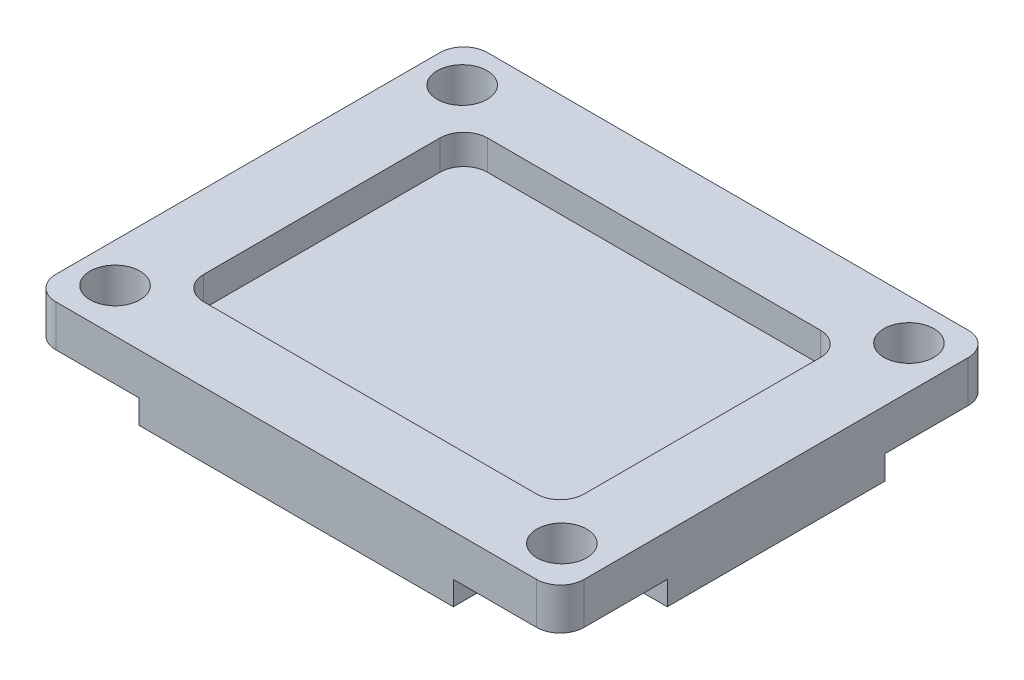
ISO-10303-21;
HEADER;
FILE_DESCRIPTION(('STEP AP214'),'2;1');
FILE_NAME('part.step','',(''),(''),'','','');
FILE_SCHEMA(('AUTOMOTIVE_DESIGN { 1 0 10303 214 1 1 1 1 }'));
ENDSEC;
DATA;
#1=APPLICATION_CONTEXT('core data for automotive mechanical design processes');
#2=APPLICATION_PROTOCOL_DEFINITION('international standard','automotive_design',2000,#1);
#3=PRODUCT_CONTEXT('',#1,'mechanical');
#4=PRODUCT('Part','Part','',(#3));
#5=PRODUCT_RELATED_PRODUCT_CATEGORY('part','',(#4));
#6=PRODUCT_DEFINITION_FORMATION('','',#4);
#7=PRODUCT_DEFINITION_CONTEXT('part definition',#1,'design');
#8=PRODUCT_DEFINITION('design','',#6,#7);
#9=PRODUCT_DEFINITION_SHAPE('','',#8);
#10=(LENGTH_UNIT() NAMED_UNIT(*) SI_UNIT(.MILLI.,.METRE.));
#11=(NAMED_UNIT(*) PLANE_ANGLE_UNIT() SI_UNIT($,.RADIAN.));
#12=(NAMED_UNIT(*) SI_UNIT($,.STERADIAN.) SOLID_ANGLE_UNIT());
#13=UNCERTAINTY_MEASURE_WITH_UNIT(LENGTH_MEASURE(1.E-05),#10,'distance_accuracy_value','');
#14=(GEOMETRIC_REPRESENTATION_CONTEXT(3) GLOBAL_UNCERTAINTY_ASSIGNED_CONTEXT((#13)) GLOBAL_UNIT_ASSIGNED_CONTEXT((#10,
#11,#12)) REPRESENTATION_CONTEXT('',''));
#15=CARTESIAN_POINT('',(0.,0.,0.));
#16=DIRECTION('',(0.,0.,1.));
#17=DIRECTION('',(1.,0.,0.));
#18=AXIS2_PLACEMENT_3D('',#15,#16,#17);
#19=CARTESIAN_POINT('',(3.30200000000001,0.,-32.891));
#20=DIRECTION('',(0.,1.,0.));
#21=DIRECTION('',(0.,0.,1.));
#22=AXIS2_PLACEMENT_3D('',#19,#20,#21);
#23=CYLINDRICAL_SURFACE('',#22,2.1);
#24=CARTESIAN_POINT('',(3.30200000000001,5.5,-32.891));
#25=DIRECTION('',(0.,1.,0.));
#26=DIRECTION('',(0.,0.,1.));
#27=AXIS2_PLACEMENT_3D('',#24,#25,#26);
#28=CIRCLE('',#27,2.1);
#29=CARTESIAN_POINT('',(3.30200000000001,5.5,-30.791));
#30=VERTEX_POINT('',#29);
#31=EDGE_CURVE('E357',#30,#30,#28,.T.);
#32=ORIENTED_EDGE('',*,*,#31,.T.);
#33=EDGE_LOOP('',(#32));
#34=FACE_BOUND('',#33,.T.);
#35=CARTESIAN_POINT('',(3.30200000000001,2.,-32.891));
#36=DIRECTION('',(0.,-1.,0.));
#37=DIRECTION('',(0.,0.,-1.));
#38=AXIS2_PLACEMENT_3D('',#35,#36,#37);
#39=CIRCLE('',#38,2.1);
#40=CARTESIAN_POINT('',(3.30200000000001,2.,-34.991));
#41=VERTEX_POINT('',#40);
#42=EDGE_CURVE('E326',#41,#41,#39,.F.);
#43=ORIENTED_EDGE('',*,*,#42,.F.);
#44=EDGE_LOOP('',(#43));
#45=FACE_BOUND('',#44,.T.);
#46=ADVANCED_FACE('F35',(#34,#45),#23,.F.);
#47=CARTESIAN_POINT('',(40.894,0.,-3.683));
#48=DIRECTION('',(0.,1.,0.));
#49=DIRECTION('',(0.,0.,1.));
#50=AXIS2_PLACEMENT_3D('',#47,#48,#49);
#51=CYLINDRICAL_SURFACE('',#50,2.1);
#52=CARTESIAN_POINT('',(40.894,5.5,-3.683));
#53=DIRECTION('',(0.,1.,0.));
#54=DIRECTION('',(0.,0.,1.));
#55=AXIS2_PLACEMENT_3D('',#52,#53,#54);
#56=CIRCLE('',#55,2.1);
#57=CARTESIAN_POINT('',(40.894,5.5,-1.583));
#58=VERTEX_POINT('',#57);
#59=EDGE_CURVE('E358',#58,#58,#56,.T.);
#60=ORIENTED_EDGE('',*,*,#59,.T.);
#61=EDGE_LOOP('',(#60));
#62=FACE_BOUND('',#61,.T.);
#63=CARTESIAN_POINT('',(40.894,2.,-3.683));
#64=DIRECTION('',(0.,-1.,0.));
#65=DIRECTION('',(0.,0.,-1.));
#66=AXIS2_PLACEMENT_3D('',#63,#64,#65);
#67=CIRCLE('',#66,2.1);
#68=CARTESIAN_POINT('',(40.894,2.,-5.783));
#69=VERTEX_POINT('',#68);
#70=EDGE_CURVE('E320',#69,#69,#67,.F.);
#71=ORIENTED_EDGE('',*,*,#70,.F.);
#72=EDGE_LOOP('',(#71));
#73=FACE_BOUND('',#72,.T.);
#74=ADVANCED_FACE('F544',(#62,#73),#51,.F.);
#75=CARTESIAN_POINT('',(2.00000000000001,5.5,-34.32));
#76=DIRECTION('',(0.,-1.,0.));
#77=DIRECTION('',(0.,0.,-1.));
#78=AXIS2_PLACEMENT_3D('',#75,#76,#77);
#79=CYLINDRICAL_SURFACE('',#78,2.);
#80=DIRECTION('',(0.,-1.,0.));
#81=VECTOR('',#80,1.);
#82=CARTESIAN_POINT('',(2.00000000000001,5.5,-36.32));
#83=LINE('',#82,#81);
#84=CARTESIAN_POINT('',(2.00000000000001,2.,-36.32));
#85=VERTEX_POINT('',#84);
#86=CARTESIAN_POINT('',(2.00000000000001,5.5,-36.32));
#87=VERTEX_POINT('',#86);
#88=EDGE_CURVE('E397',#85,#87,#83,.F.);
#89=ORIENTED_EDGE('',*,*,#88,.F.);
#90=CARTESIAN_POINT('',(2.00000000000001,2.,-34.32));
#91=DIRECTION('',(0.,-1.,0.));
#92=DIRECTION('',(0.,0.,-1.));
#93=AXIS2_PLACEMENT_3D('',#90,#91,#92);
#94=CIRCLE('',#93,2.);
#95=CARTESIAN_POINT('',(0.,2.,-34.32));
#96=VERTEX_POINT('',#95);
#97=EDGE_CURVE('E11',#85,#96,#94,.F.);
#98=ORIENTED_EDGE('',*,*,#97,.T.);
#99=DIRECTION('',(0.,-1.,0.));
#100=VECTOR('',#99,1.);
#101=CARTESIAN_POINT('',(0.,5.5,-34.32));
#102=LINE('',#101,#100);
#103=CARTESIAN_POINT('',(0.,5.5,-34.32));
#104=VERTEX_POINT('',#103);
#105=EDGE_CURVE('E391',#104,#96,#102,.T.);
#106=ORIENTED_EDGE('',*,*,#105,.F.);
#107=CARTESIAN_POINT('',(2.00000000000001,5.5,-34.32));
#108=DIRECTION('',(0.,1.,0.));
#109=DIRECTION('',(0.,0.,1.));
#110=AXIS2_PLACEMENT_3D('',#107,#108,#109);
#111=CIRCLE('',#110,2.);
#112=EDGE_CURVE('E405',#87,#104,#111,.T.);
#113=ORIENTED_EDGE('',*,*,#112,.F.);
#114=EDGE_LOOP('',(#89,#98,#106,#113));
#115=FACE_BOUND('',#114,.T.);
#116=ADVANCED_FACE('F480',(#115),#79,.T.);
#117=CARTESIAN_POINT('',(42.45,5.5,-2.));
#118=DIRECTION('',(0.,-1.,0.));
#119=DIRECTION('',(0.,0.,-1.));
#120=AXIS2_PLACEMENT_3D('',#117,#118,#119);
#121=CYLINDRICAL_SURFACE('',#120,2.);
#122=DIRECTION('',(0.,-1.,0.));
#123=VECTOR('',#122,1.);
#124=CARTESIAN_POINT('',(42.45,5.5,0.));
#125=LINE('',#124,#123);
#126=CARTESIAN_POINT('',(42.45,2.,0.));
#127=VERTEX_POINT('',#126);
#128=CARTESIAN_POINT('',(42.45,5.5,0.));
#129=VERTEX_POINT('',#128);
#130=EDGE_CURVE('E415',#127,#129,#125,.F.);
#131=ORIENTED_EDGE('',*,*,#130,.F.);
#132=CARTESIAN_POINT('',(42.45,2.,-2.));
#133=DIRECTION('',(0.,-1.,0.));
#134=DIRECTION('',(0.,0.,-1.));
#135=AXIS2_PLACEMENT_3D('',#132,#133,#134);
#136=CIRCLE('',#135,2.);
#137=CARTESIAN_POINT('',(44.45,2.,-2.));
#138=VERTEX_POINT('',#137);
#139=EDGE_CURVE('E455',#127,#138,#136,.F.);
#140=ORIENTED_EDGE('',*,*,#139,.T.);
#141=DIRECTION('',(0.,-1.,0.));
#142=VECTOR('',#141,1.);
#143=CARTESIAN_POINT('',(44.45,5.5,-2.));
#144=LINE('',#143,#142);
#145=CARTESIAN_POINT('',(44.45,5.5,-2.));
#146=VERTEX_POINT('',#145);
#147=EDGE_CURVE('E407',#146,#138,#144,.T.);
#148=ORIENTED_EDGE('',*,*,#147,.F.);
#149=CARTESIAN_POINT('',(42.45,5.5,-2.));
#150=DIRECTION('',(0.,1.,0.));
#151=DIRECTION('',(0.,0.,1.));
#152=AXIS2_PLACEMENT_3D('',#149,#150,#151);
#153=CIRCLE('',#152,2.);
#154=EDGE_CURVE('E401',#129,#146,#153,.T.);
#155=ORIENTED_EDGE('',*,*,#154,.F.);
#156=EDGE_LOOP('',(#131,#140,#148,#155));
#157=FACE_BOUND('',#156,.T.);
#158=ADVANCED_FACE('F500',(#157),#121,.T.);
#159=CARTESIAN_POINT('',(0.,5.5,-36.32));
#160=DIRECTION('',(1.,0.,0.));
#161=DIRECTION('',(0.,0.,-1.));
#162=AXIS2_PLACEMENT_3D('',#159,#160,#161);
#163=PLANE('',#162);
#164=DIRECTION('',(0.,0.,-1.));
#165=VECTOR('',#164,1.);
#166=CARTESIAN_POINT('',(0.,2.,-27.32));
#167=LINE('',#166,#165);
#168=CARTESIAN_POINT('',(0.,2.,-27.32));
#169=VERTEX_POINT('',#168);
#170=EDGE_CURVE('E50',#169,#96,#167,.T.);
#171=ORIENTED_EDGE('',*,*,#170,.F.);
#172=DIRECTION('',(0.,-1.,0.));
#173=VECTOR('',#172,1.);
#174=CARTESIAN_POINT('',(0.,2.,-27.32));
#175=LINE('',#174,#173);
#176=CARTESIAN_POINT('',(0.,0.,-27.32));
#177=VERTEX_POINT('',#176);
#178=EDGE_CURVE('E270',#169,#177,#175,.T.);
#179=ORIENTED_EDGE('',*,*,#178,.T.);
#180=DIRECTION('',(0.,0.,1.));
#181=VECTOR('',#180,1.);
#182=CARTESIAN_POINT('',(0.,0.,-36.32));
#183=LINE('',#182,#181);
#184=CARTESIAN_POINT('',(0.,0.,-9.));
#185=VERTEX_POINT('',#184);
#186=EDGE_CURVE('E365',#177,#185,#183,.T.);
#187=ORIENTED_EDGE('',*,*,#186,.T.);
#188=DIRECTION('',(0.,-1.,0.));
#189=VECTOR('',#188,1.);
#190=CARTESIAN_POINT('',(0.,2.,-9.));
#191=LINE('',#190,#189);
#192=CARTESIAN_POINT('',(0.,2.,-9.));
#193=VERTEX_POINT('',#192);
#194=EDGE_CURVE('E307',#193,#185,#191,.T.);
#195=ORIENTED_EDGE('',*,*,#194,.F.);
#196=DIRECTION('',(0.,0.,-1.));
#197=VECTOR('',#196,1.);
#198=CARTESIAN_POINT('',(0.,2.,-9.));
#199=LINE('',#198,#197);
#200=CARTESIAN_POINT('',(0.,2.,-2.));
#201=VERTEX_POINT('',#200);
#202=EDGE_CURVE('E296',#201,#193,#199,.T.);
#203=ORIENTED_EDGE('',*,*,#202,.F.);
#204=DIRECTION('',(0.,-1.,0.));
#205=VECTOR('',#204,1.);
#206=CARTESIAN_POINT('',(0.,5.5,-2.));
#207=LINE('',#206,#205);
#208=CARTESIAN_POINT('',(0.,5.5,-2.));
#209=VERTEX_POINT('',#208);
#210=EDGE_CURVE('E379',#201,#209,#207,.F.);
#211=ORIENTED_EDGE('',*,*,#210,.T.);
#212=DIRECTION('',(0.,0.,1.));
#213=VECTOR('',#212,1.);
#214=CARTESIAN_POINT('',(0.,5.5,-36.32));
#215=LINE('',#214,#213);
#216=EDGE_CURVE('E366',#104,#209,#215,.T.);
#217=ORIENTED_EDGE('',*,*,#216,.F.);
#218=ORIENTED_EDGE('',*,*,#105,.T.);
#219=EDGE_LOOP('',(#171,#179,#187,#195,#203,#211,#217,#218));
#220=FACE_BOUND('',#219,.T.);
#221=ADVANCED_FACE('F485',(#220),#163,.F.);
#222=CARTESIAN_POINT('',(0.,5.5,0.));
#223=DIRECTION('',(0.,0.,-1.));
#224=DIRECTION('',(-1.,0.,0.));
#225=AXIS2_PLACEMENT_3D('',#222,#223,#224);
#226=PLANE('',#225);
#227=DIRECTION('',(1.,0.,0.));
#228=VECTOR('',#227,1.);
#229=CARTESIAN_POINT('',(0.,0.,0.));
#230=LINE('',#229,#228);
#231=CARTESIAN_POINT('',(9.00000000000001,0.,0.));
#232=VERTEX_POINT('',#231);
#233=CARTESIAN_POINT('',(35.45,0.,0.));
#234=VERTEX_POINT('',#233);
#235=EDGE_CURVE('E382',#232,#234,#230,.T.);
#236=ORIENTED_EDGE('',*,*,#235,.T.);
#237=DIRECTION('',(0.,-1.,0.));
#238=VECTOR('',#237,1.);
#239=CARTESIAN_POINT('',(35.45,2.,0.));
#240=LINE('',#239,#238);
#241=CARTESIAN_POINT('',(35.45,2.,0.));
#242=VERTEX_POINT('',#241);
#243=EDGE_CURVE('E253',#242,#234,#240,.T.);
#244=ORIENTED_EDGE('',*,*,#243,.F.);
#245=DIRECTION('',(-1.,0.,0.));
#246=VECTOR('',#245,1.);
#247=CARTESIAN_POINT('',(35.45,2.,0.));
#248=LINE('',#247,#246);
#249=EDGE_CURVE('E232',#127,#242,#248,.T.);
#250=ORIENTED_EDGE('',*,*,#249,.F.);
#251=ORIENTED_EDGE('',*,*,#130,.T.);
#252=DIRECTION('',(1.,0.,0.));
#253=VECTOR('',#252,1.);
#254=CARTESIAN_POINT('',(0.,5.5,0.));
#255=LINE('',#254,#253);
#256=CARTESIAN_POINT('',(2.,5.5,0.));
#257=VERTEX_POINT('',#256);
#258=EDGE_CURVE('E369',#257,#129,#255,.T.);
#259=ORIENTED_EDGE('',*,*,#258,.F.);
#260=DIRECTION('',(0.,-1.,0.));
#261=VECTOR('',#260,1.);
#262=CARTESIAN_POINT('',(2.,5.5,0.));
#263=LINE('',#262,#261);
#264=CARTESIAN_POINT('',(2.,2.,0.));
#265=VERTEX_POINT('',#264);
#266=EDGE_CURVE('E412',#257,#265,#263,.T.);
#267=ORIENTED_EDGE('',*,*,#266,.T.);
#268=DIRECTION('',(-1.,0.,0.));
#269=VECTOR('',#268,1.);
#270=CARTESIAN_POINT('',(0.,2.,0.));
#271=LINE('',#270,#269);
#272=CARTESIAN_POINT('',(9.00000000000001,2.,0.));
#273=VERTEX_POINT('',#272);
#274=EDGE_CURVE('E305',#273,#265,#271,.T.);
#275=ORIENTED_EDGE('',*,*,#274,.F.);
#276=DIRECTION('',(0.,-1.,0.));
#277=VECTOR('',#276,1.);
#278=CARTESIAN_POINT('',(9.00000000000001,2.,0.));
#279=LINE('',#278,#277);
#280=EDGE_CURVE('E311',#273,#232,#279,.T.);
#281=ORIENTED_EDGE('',*,*,#280,.T.);
#282=EDGE_LOOP('',(#236,#244,#250,#251,#259,#267,#275,#281));
#283=FACE_BOUND('',#282,.T.);
#284=ADVANCED_FACE('F496',(#283),#226,.F.);
#285=CARTESIAN_POINT('',(44.45,5.5,-36.32));
#286=DIRECTION('',(-1.,0.,0.));
#287=DIRECTION('',(0.,0.,1.));
#288=AXIS2_PLACEMENT_3D('',#285,#286,#287);
#289=PLANE('',#288);
#290=DIRECTION('',(0.,0.,-1.));
#291=VECTOR('',#290,1.);
#292=CARTESIAN_POINT('',(44.45,0.,-36.32));
#293=LINE('',#292,#291);
#294=CARTESIAN_POINT('',(44.45,0.,-9.));
#295=VERTEX_POINT('',#294);
#296=CARTESIAN_POINT('',(44.45,0.,-27.32));
#297=VERTEX_POINT('',#296);
#298=EDGE_CURVE('E385',#295,#297,#293,.T.);
#299=ORIENTED_EDGE('',*,*,#298,.T.);
#300=DIRECTION('',(0.,-1.,0.));
#301=VECTOR('',#300,1.);
#302=CARTESIAN_POINT('',(44.45,2.,-27.32));
#303=LINE('',#302,#301);
#304=CARTESIAN_POINT('',(44.45,2.,-27.32));
#305=VERTEX_POINT('',#304);
#306=EDGE_CURVE('E266',#305,#297,#303,.T.);
#307=ORIENTED_EDGE('',*,*,#306,.F.);
#308=DIRECTION('',(0.,0.,1.));
#309=VECTOR('',#308,1.);
#310=CARTESIAN_POINT('',(44.45,2.,-27.32));
#311=LINE('',#310,#309);
#312=CARTESIAN_POINT('',(44.45,2.,-34.32));
#313=VERTEX_POINT('',#312);
#314=EDGE_CURVE('E257',#313,#305,#311,.T.);
#315=ORIENTED_EDGE('',*,*,#314,.F.);
#316=DIRECTION('',(0.,-1.,0.));
#317=VECTOR('',#316,1.);
#318=CARTESIAN_POINT('',(44.45,5.5,-34.32));
#319=LINE('',#318,#317);
#320=CARTESIAN_POINT('',(44.45,5.5,-34.32));
#321=VERTEX_POINT('',#320);
#322=EDGE_CURVE('E410',#313,#321,#319,.F.);
#323=ORIENTED_EDGE('',*,*,#322,.T.);
#324=DIRECTION('',(0.,0.,-1.));
#325=VECTOR('',#324,1.);
#326=CARTESIAN_POINT('',(44.45,5.5,-36.32));
#327=LINE('',#326,#325);
#328=EDGE_CURVE('E373',#146,#321,#327,.T.);
#329=ORIENTED_EDGE('',*,*,#328,.F.);
#330=ORIENTED_EDGE('',*,*,#147,.T.);
#331=DIRECTION('',(0.,0.,1.));
#332=VECTOR('',#331,1.);
#333=CARTESIAN_POINT('',(44.45,2.,0.));
#334=LINE('',#333,#332);
#335=CARTESIAN_POINT('',(44.45,2.,-9.));
#336=VERTEX_POINT('',#335);
#337=EDGE_CURVE('E240',#336,#138,#334,.T.);
#338=ORIENTED_EDGE('',*,*,#337,.F.);
#339=DIRECTION('',(0.,-1.,0.));
#340=VECTOR('',#339,1.);
#341=CARTESIAN_POINT('',(44.45,2.,-9.));
#342=LINE('',#341,#340);
#343=EDGE_CURVE('E231',#336,#295,#342,.T.);
#344=ORIENTED_EDGE('',*,*,#343,.T.);
#345=EDGE_LOOP('',(#299,#307,#315,#323,#329,#330,#338,#344));
#346=FACE_BOUND('',#345,.T.);
#347=ADVANCED_FACE('F466',(#346),#289,.F.);
#348=CARTESIAN_POINT('',(0.,5.5,-36.32));
#349=DIRECTION('',(0.,0.,1.));
#350=DIRECTION('',(1.,0.,0.));
#351=AXIS2_PLACEMENT_3D('',#348,#349,#350);
#352=PLANE('',#351);
#353=DIRECTION('',(-1.,0.,0.));
#354=VECTOR('',#353,1.);
#355=CARTESIAN_POINT('',(0.,0.,-36.32));
#356=LINE('',#355,#354);
#357=CARTESIAN_POINT('',(35.45,0.,-36.32));
#358=VERTEX_POINT('',#357);
#359=CARTESIAN_POINT('',(9.00000000000001,0.,-36.32));
#360=VERTEX_POINT('',#359);
#361=EDGE_CURVE('E370',#358,#360,#356,.T.);
#362=ORIENTED_EDGE('',*,*,#361,.T.);
#363=DIRECTION('',(0.,-1.,0.));
#364=VECTOR('',#363,1.);
#365=CARTESIAN_POINT('',(9.00000000000001,2.,-36.32));
#366=LINE('',#365,#364);
#367=CARTESIAN_POINT('',(9.00000000000001,2.,-36.32));
#368=VERTEX_POINT('',#367);
#369=EDGE_CURVE('E286',#368,#360,#366,.T.);
#370=ORIENTED_EDGE('',*,*,#369,.F.);
#371=DIRECTION('',(1.,0.,0.));
#372=VECTOR('',#371,1.);
#373=CARTESIAN_POINT('',(0.,2.,-36.32));
#374=LINE('',#373,#372);
#375=EDGE_CURVE('E278',#85,#368,#374,.T.);
#376=ORIENTED_EDGE('',*,*,#375,.F.);
#377=ORIENTED_EDGE('',*,*,#88,.T.);
#378=DIRECTION('',(-1.,0.,0.));
#379=VECTOR('',#378,1.);
#380=CARTESIAN_POINT('',(0.,5.5,-36.32));
#381=LINE('',#380,#379);
#382=CARTESIAN_POINT('',(42.45,5.5,-36.32));
#383=VERTEX_POINT('',#382);
#384=EDGE_CURVE('E376',#383,#87,#381,.T.);
#385=ORIENTED_EDGE('',*,*,#384,.F.);
#386=DIRECTION('',(0.,-1.,0.));
#387=VECTOR('',#386,1.);
#388=CARTESIAN_POINT('',(42.45,5.5,-36.32));
#389=LINE('',#388,#387);
#390=CARTESIAN_POINT('',(42.45,2.,-36.32));
#391=VERTEX_POINT('',#390);
#392=EDGE_CURVE('E394',#383,#391,#389,.T.);
#393=ORIENTED_EDGE('',*,*,#392,.T.);
#394=DIRECTION('',(1.,0.,0.));
#395=VECTOR('',#394,1.);
#396=CARTESIAN_POINT('',(44.45,2.,-36.32));
#397=LINE('',#396,#395);
#398=CARTESIAN_POINT('',(35.45,2.,-36.32));
#399=VERTEX_POINT('',#398);
#400=EDGE_CURVE('E57',#399,#391,#397,.T.);
#401=ORIENTED_EDGE('',*,*,#400,.F.);
#402=DIRECTION('',(0.,-1.,0.));
#403=VECTOR('',#402,1.);
#404=CARTESIAN_POINT('',(35.45,2.,-36.32));
#405=LINE('',#404,#403);
#406=EDGE_CURVE('E251',#399,#358,#405,.T.);
#407=ORIENTED_EDGE('',*,*,#406,.T.);
#408=EDGE_LOOP('',(#362,#370,#376,#377,#385,#393,#401,#407));
#409=FACE_BOUND('',#408,.T.);
#410=ADVANCED_FACE('F475',(#409),#352,.F.);
#411=CARTESIAN_POINT('',(0.,5.5,0.));
#412=DIRECTION('',(0.,1.,0.));
#413=DIRECTION('',(0.,0.,1.));
#414=AXIS2_PLACEMENT_3D('',#411,#412,#413);
#415=PLANE('',#414);
#416=DIRECTION('',(-1.,0.,0.));
#417=VECTOR('',#416,1.);
#418=CARTESIAN_POINT('',(0.,5.5,-30.1));
#419=LINE('',#418,#417);
#420=CARTESIAN_POINT('',(36.23,5.5,-30.1));
#421=VERTEX_POINT('',#420);
#422=CARTESIAN_POINT('',(8.22,5.5,-30.1));
#423=VERTEX_POINT('',#422);
#424=EDGE_CURVE('E329',#421,#423,#419,.T.);
#425=ORIENTED_EDGE('',*,*,#424,.F.);
#426=CARTESIAN_POINT('',(36.23,5.5,-28.1));
#427=DIRECTION('',(0.,1.,0.));
#428=DIRECTION('',(0.,0.,1.));
#429=AXIS2_PLACEMENT_3D('',#426,#427,#428);
#430=CIRCLE('',#429,2.);
#431=CARTESIAN_POINT('',(38.23,5.5,-28.1));
#432=VERTEX_POINT('',#431);
#433=EDGE_CURVE('E445',#421,#432,#430,.F.);
#434=ORIENTED_EDGE('',*,*,#433,.T.);
#435=DIRECTION('',(0.,0.,-1.));
#436=VECTOR('',#435,1.);
#437=CARTESIAN_POINT('',(38.23,5.5,0.));
#438=LINE('',#437,#436);
#439=CARTESIAN_POINT('',(38.23,5.5,-8.22));
#440=VERTEX_POINT('',#439);
#441=EDGE_CURVE('E334',#440,#432,#438,.T.);
#442=ORIENTED_EDGE('',*,*,#441,.F.);
#443=CARTESIAN_POINT('',(36.23,5.5,-8.22));
#444=DIRECTION('',(0.,1.,0.));
#445=DIRECTION('',(0.,0.,1.));
#446=AXIS2_PLACEMENT_3D('',#443,#444,#445);
#447=CIRCLE('',#446,2.);
#448=CARTESIAN_POINT('',(36.23,5.5,-6.22));
#449=VERTEX_POINT('',#448);
#450=EDGE_CURVE('E451',#440,#449,#447,.F.);
#451=ORIENTED_EDGE('',*,*,#450,.T.);
#452=DIRECTION('',(1.,0.,0.));
#453=VECTOR('',#452,1.);
#454=CARTESIAN_POINT('',(0.,5.5,-6.22));
#455=LINE('',#454,#453);
#456=CARTESIAN_POINT('',(8.22,5.5,-6.22));
#457=VERTEX_POINT('',#456);
#458=EDGE_CURVE('E349',#457,#449,#455,.T.);
#459=ORIENTED_EDGE('',*,*,#458,.F.);
#460=CARTESIAN_POINT('',(8.22,5.5,-8.22));
#461=DIRECTION('',(0.,1.,0.));
#462=DIRECTION('',(0.,0.,1.));
#463=AXIS2_PLACEMENT_3D('',#460,#461,#462);
#464=CIRCLE('',#463,2.);
#465=CARTESIAN_POINT('',(6.22,5.5,-8.22));
#466=VERTEX_POINT('',#465);
#467=EDGE_CURVE('E449',#457,#466,#464,.F.);
#468=ORIENTED_EDGE('',*,*,#467,.T.);
#469=DIRECTION('',(0.,0.,1.));
#470=VECTOR('',#469,1.);
#471=CARTESIAN_POINT('',(6.22,5.5,0.));
#472=LINE('',#471,#470);
#473=CARTESIAN_POINT('',(6.22,5.5,-28.1));
#474=VERTEX_POINT('',#473);
#475=EDGE_CURVE('E346',#474,#466,#472,.T.);
#476=ORIENTED_EDGE('',*,*,#475,.F.);
#477=CARTESIAN_POINT('',(8.22,5.5,-28.1));
#478=DIRECTION('',(0.,1.,0.));
#479=DIRECTION('',(0.,0.,1.));
#480=AXIS2_PLACEMENT_3D('',#477,#478,#479);
#481=CIRCLE('',#480,2.);
#482=EDGE_CURVE('E447',#474,#423,#481,.F.);
#483=ORIENTED_EDGE('',*,*,#482,.T.);
#484=EDGE_LOOP('',(#425,#434,#442,#451,#459,#468,#476,#483));
#485=FACE_BOUND('',#484,.T.);
#486=CARTESIAN_POINT('',(3.30200000000001,5.5,-3.683));
#487=DIRECTION('',(0.,1.,0.));
#488=DIRECTION('',(0.,0.,1.));
#489=AXIS2_PLACEMENT_3D('',#486,#487,#488);
#490=CIRCLE('',#489,2.1);
#491=CARTESIAN_POINT('',(3.30200000000001,5.5,-1.583));
#492=VERTEX_POINT('',#491);
#493=EDGE_CURVE('E343',#492,#492,#490,.T.);
#494=ORIENTED_EDGE('',*,*,#493,.F.);
#495=EDGE_LOOP('',(#494));
#496=FACE_BOUND('',#495,.T.);
#497=ORIENTED_EDGE('',*,*,#59,.F.);
#498=EDGE_LOOP('',(#497));
#499=FACE_BOUND('',#498,.T.);
#500=CARTESIAN_POINT('',(40.894,5.5,-32.89));
#501=DIRECTION('',(0.,1.,0.));
#502=DIRECTION('',(0.,0.,1.));
#503=AXIS2_PLACEMENT_3D('',#500,#501,#502);
#504=CIRCLE('',#503,2.1);
#505=CARTESIAN_POINT('',(40.894,5.5,-30.79));
#506=VERTEX_POINT('',#505);
#507=EDGE_CURVE('E354',#506,#506,#504,.T.);
#508=ORIENTED_EDGE('',*,*,#507,.F.);
#509=EDGE_LOOP('',(#508));
#510=FACE_BOUND('',#509,.T.);
#511=ORIENTED_EDGE('',*,*,#31,.F.);
#512=EDGE_LOOP('',(#511));
#513=FACE_BOUND('',#512,.T.);
#514=ORIENTED_EDGE('',*,*,#384,.T.);
#515=ORIENTED_EDGE('',*,*,#112,.T.);
#516=ORIENTED_EDGE('',*,*,#216,.T.);
#517=CARTESIAN_POINT('',(2.,5.5,-2.));
#518=DIRECTION('',(0.,1.,0.));
#519=DIRECTION('',(0.,0.,1.));
#520=AXIS2_PLACEMENT_3D('',#517,#518,#519);
#521=CIRCLE('',#520,2.);
#522=EDGE_CURVE('E399',#209,#257,#521,.T.);
#523=ORIENTED_EDGE('',*,*,#522,.T.);
#524=ORIENTED_EDGE('',*,*,#258,.T.);
#525=ORIENTED_EDGE('',*,*,#154,.T.);
#526=ORIENTED_EDGE('',*,*,#328,.T.);
#527=CARTESIAN_POINT('',(42.45,5.5,-34.32));
#528=DIRECTION('',(0.,1.,0.));
#529=DIRECTION('',(0.,0.,1.));
#530=AXIS2_PLACEMENT_3D('',#527,#528,#529);
#531=CIRCLE('',#530,2.);
#532=EDGE_CURVE('E403',#321,#383,#531,.T.);
#533=ORIENTED_EDGE('',*,*,#532,.T.);
#534=EDGE_LOOP('',(#514,#515,#516,#523,#524,#525,#526,#533));
#535=FACE_BOUND('',#534,.T.);
#536=ADVANCED_FACE('F472',(#485,#496,#499,#510,#513,#535),#415,.T.);
#537=CARTESIAN_POINT('',(0.,0.,0.));
#538=DIRECTION('',(0.,1.,0.));
#539=DIRECTION('',(0.,0.,1.));
#540=AXIS2_PLACEMENT_3D('',#537,#538,#539);
#541=PLANE('',#540);
#542=ORIENTED_EDGE('',*,*,#186,.F.);
#543=DIRECTION('',(-1.,0.,0.));
#544=VECTOR('',#543,1.);
#545=CARTESIAN_POINT('',(0.,0.,-27.32));
#546=LINE('',#545,#544);
#547=CARTESIAN_POINT('',(9.00000000000001,0.,-27.32));
#548=VERTEX_POINT('',#547);
#549=EDGE_CURVE('E279',#548,#177,#546,.T.);
#550=ORIENTED_EDGE('',*,*,#549,.F.);
#551=DIRECTION('',(0.,0.,1.));
#552=VECTOR('',#551,1.);
#553=CARTESIAN_POINT('',(9.00000000000001,0.,-27.32));
#554=LINE('',#553,#552);
#555=EDGE_CURVE('E287',#360,#548,#554,.T.);
#556=ORIENTED_EDGE('',*,*,#555,.F.);
#557=ORIENTED_EDGE('',*,*,#361,.F.);
#558=DIRECTION('',(0.,0.,-1.));
#559=VECTOR('',#558,1.);
#560=CARTESIAN_POINT('',(35.45,0.,-27.32));
#561=LINE('',#560,#559);
#562=CARTESIAN_POINT('',(35.45,0.,-27.32));
#563=VERTEX_POINT('',#562);
#564=EDGE_CURVE('E260',#563,#358,#561,.T.);
#565=ORIENTED_EDGE('',*,*,#564,.F.);
#566=DIRECTION('',(-1.,0.,0.));
#567=VECTOR('',#566,1.);
#568=CARTESIAN_POINT('',(44.45,0.,-27.32));
#569=LINE('',#568,#567);
#570=EDGE_CURVE('E267',#297,#563,#569,.T.);
#571=ORIENTED_EDGE('',*,*,#570,.F.);
#572=ORIENTED_EDGE('',*,*,#298,.F.);
#573=DIRECTION('',(1.,0.,0.));
#574=VECTOR('',#573,1.);
#575=CARTESIAN_POINT('',(35.45,0.,-9.));
#576=LINE('',#575,#574);
#577=CARTESIAN_POINT('',(35.45,0.,-9.));
#578=VERTEX_POINT('',#577);
#579=EDGE_CURVE('E245',#578,#295,#576,.T.);
#580=ORIENTED_EDGE('',*,*,#579,.F.);
#581=DIRECTION('',(0.,0.,-1.));
#582=VECTOR('',#581,1.);
#583=CARTESIAN_POINT('',(35.45,0.,0.));
#584=LINE('',#583,#582);
#585=EDGE_CURVE('E228',#234,#578,#584,.T.);
#586=ORIENTED_EDGE('',*,*,#585,.F.);
#587=ORIENTED_EDGE('',*,*,#235,.F.);
#588=DIRECTION('',(0.,0.,1.));
#589=VECTOR('',#588,1.);
#590=CARTESIAN_POINT('',(9.00000000000001,0.,-9.));
#591=LINE('',#590,#589);
#592=CARTESIAN_POINT('',(9.00000000000001,0.,-9.));
#593=VERTEX_POINT('',#592);
#594=EDGE_CURVE('E299',#593,#232,#591,.T.);
#595=ORIENTED_EDGE('',*,*,#594,.F.);
#596=DIRECTION('',(1.,0.,0.));
#597=VECTOR('',#596,1.);
#598=CARTESIAN_POINT('',(0.,0.,-9.));
#599=LINE('',#598,#597);
#600=EDGE_CURVE('E255',#185,#593,#599,.T.);
#601=ORIENTED_EDGE('',*,*,#600,.F.);
#602=EDGE_LOOP('',(#542,#550,#556,#557,#565,#571,#572,#580,#586,#587,#595,#601));
#603=FACE_BOUND('',#602,.T.);
#604=ADVANCED_FACE('F506',(#603),#541,.F.);
#605=CARTESIAN_POINT('',(40.894,0.,-32.89));
#606=DIRECTION('',(0.,1.,0.));
#607=DIRECTION('',(0.,0.,1.));
#608=AXIS2_PLACEMENT_3D('',#605,#606,#607);
#609=CYLINDRICAL_SURFACE('',#608,2.1);
#610=CARTESIAN_POINT('',(40.894,2.,-32.89));
#611=DIRECTION('',(0.,1.,0.));
#612=DIRECTION('',(0.,0.,1.));
#613=AXIS2_PLACEMENT_3D('',#610,#611,#612);
#614=CIRCLE('',#613,2.1);
#615=CARTESIAN_POINT('',(40.894,2.,-30.79));
#616=VERTEX_POINT('',#615);
#617=EDGE_CURVE('E323',#616,#616,#614,.F.);
#618=ORIENTED_EDGE('',*,*,#617,.T.);
#619=EDGE_LOOP('',(#618));
#620=FACE_BOUND('',#619,.T.);
#621=ORIENTED_EDGE('',*,*,#507,.T.);
#622=EDGE_LOOP('',(#621));
#623=FACE_BOUND('',#622,.T.);
#624=ADVANCED_FACE('F561',(#620,#623),#609,.F.);
#625=CARTESIAN_POINT('',(3.30200000000001,0.,-3.683));
#626=DIRECTION('',(0.,1.,0.));
#627=DIRECTION('',(0.,0.,1.));
#628=AXIS2_PLACEMENT_3D('',#625,#626,#627);
#629=CYLINDRICAL_SURFACE('',#628,2.1);
#630=CARTESIAN_POINT('',(3.30200000000001,2.,-3.683));
#631=DIRECTION('',(0.,1.,0.));
#632=DIRECTION('',(0.,0.,1.));
#633=AXIS2_PLACEMENT_3D('',#630,#631,#632);
#634=CIRCLE('',#633,2.1);
#635=CARTESIAN_POINT('',(3.30200000000001,2.,-1.583));
#636=VERTEX_POINT('',#635);
#637=EDGE_CURVE('E314',#636,#636,#634,.F.);
#638=ORIENTED_EDGE('',*,*,#637,.T.);
#639=EDGE_LOOP('',(#638));
#640=FACE_BOUND('',#639,.T.);
#641=ORIENTED_EDGE('',*,*,#493,.T.);
#642=EDGE_LOOP('',(#641));
#643=FACE_BOUND('',#642,.T.);
#644=ADVANCED_FACE('F555',(#640,#643),#629,.F.);
#645=CARTESIAN_POINT('',(42.45,5.5,-34.32));
#646=DIRECTION('',(0.,-1.,0.));
#647=DIRECTION('',(0.,0.,-1.));
#648=AXIS2_PLACEMENT_3D('',#645,#646,#647);
#649=CYLINDRICAL_SURFACE('',#648,2.);
#650=CARTESIAN_POINT('',(42.45,2.,-34.32));
#651=DIRECTION('',(0.,1.,0.));
#652=DIRECTION('',(0.,0.,1.));
#653=AXIS2_PLACEMENT_3D('',#650,#651,#652);
#654=CIRCLE('',#653,2.);
#655=EDGE_CURVE('E43',#391,#313,#654,.F.);
#656=ORIENTED_EDGE('',*,*,#655,.F.);
#657=ORIENTED_EDGE('',*,*,#392,.F.);
#658=ORIENTED_EDGE('',*,*,#532,.F.);
#659=ORIENTED_EDGE('',*,*,#322,.F.);
#660=EDGE_LOOP('',(#656,#657,#658,#659));
#661=FACE_BOUND('',#660,.T.);
#662=ADVANCED_FACE('F469',(#661),#649,.T.);
#663=CARTESIAN_POINT('',(2.,5.5,-2.));
#664=DIRECTION('',(0.,-1.,0.));
#665=DIRECTION('',(0.,0.,-1.));
#666=AXIS2_PLACEMENT_3D('',#663,#664,#665);
#667=CYLINDRICAL_SURFACE('',#666,2.);
#668=CARTESIAN_POINT('',(2.,2.,-2.));
#669=DIRECTION('',(0.,1.,0.));
#670=DIRECTION('',(0.,0.,1.));
#671=AXIS2_PLACEMENT_3D('',#668,#669,#670);
#672=CIRCLE('',#671,2.);
#673=EDGE_CURVE('E453',#265,#201,#672,.F.);
#674=ORIENTED_EDGE('',*,*,#673,.F.);
#675=ORIENTED_EDGE('',*,*,#266,.F.);
#676=ORIENTED_EDGE('',*,*,#522,.F.);
#677=ORIENTED_EDGE('',*,*,#210,.F.);
#678=EDGE_LOOP('',(#674,#675,#676,#677));
#679=FACE_BOUND('',#678,.T.);
#680=ADVANCED_FACE('F491',(#679),#667,.T.);
#681=CARTESIAN_POINT('',(0.,3.,-30.1));
#682=DIRECTION('',(0.,0.,-1.));
#683=DIRECTION('',(-1.,0.,0.));
#684=AXIS2_PLACEMENT_3D('',#681,#682,#683);
#685=PLANE('',#684);
#686=DIRECTION('',(-1.,0.,0.));
#687=VECTOR('',#686,1.);
#688=CARTESIAN_POINT('',(0.,3.,-30.1));
#689=LINE('',#688,#687);
#690=CARTESIAN_POINT('',(36.23,3.,-30.1));
#691=VERTEX_POINT('',#690);
#692=CARTESIAN_POINT('',(8.22,3.,-30.1));
#693=VERTEX_POINT('',#692);
#694=EDGE_CURVE('E330',#691,#693,#689,.T.);
#695=ORIENTED_EDGE('',*,*,#694,.F.);
#696=DIRECTION('',(0.,1.,0.));
#697=VECTOR('',#696,1.);
#698=CARTESIAN_POINT('',(36.23,5.5,-30.1));
#699=LINE('',#698,#697);
#700=EDGE_CURVE('E419',#691,#421,#699,.T.);
#701=ORIENTED_EDGE('',*,*,#700,.T.);
#702=ORIENTED_EDGE('',*,*,#424,.T.);
#703=DIRECTION('',(0.,1.,0.));
#704=VECTOR('',#703,1.);
#705=CARTESIAN_POINT('',(8.22,3.,-30.1));
#706=LINE('',#705,#704);
#707=EDGE_CURVE('E417',#423,#693,#706,.F.);
#708=ORIENTED_EDGE('',*,*,#707,.T.);
#709=EDGE_LOOP('',(#695,#701,#702,#708));
#710=FACE_BOUND('',#709,.T.);
#711=ADVANCED_FACE('F578',(#710),#685,.F.);
#712=CARTESIAN_POINT('',(38.23,3.,0.));
#713=DIRECTION('',(1.,0.,0.));
#714=DIRECTION('',(0.,0.,-1.));
#715=AXIS2_PLACEMENT_3D('',#712,#713,#714);
#716=PLANE('',#715);
#717=ORIENTED_EDGE('',*,*,#441,.T.);
#718=DIRECTION('',(0.,1.,0.));
#719=VECTOR('',#718,1.);
#720=CARTESIAN_POINT('',(38.23,3.,-28.1));
#721=LINE('',#720,#719);
#722=CARTESIAN_POINT('',(38.23,3.,-28.1));
#723=VERTEX_POINT('',#722);
#724=EDGE_CURVE('E425',#432,#723,#721,.F.);
#725=ORIENTED_EDGE('',*,*,#724,.T.);
#726=DIRECTION('',(0.,0.,-1.));
#727=VECTOR('',#726,1.);
#728=CARTESIAN_POINT('',(38.23,3.,0.));
#729=LINE('',#728,#727);
#730=CARTESIAN_POINT('',(38.23,3.,-8.22));
#731=VERTEX_POINT('',#730);
#732=EDGE_CURVE('E340',#731,#723,#729,.T.);
#733=ORIENTED_EDGE('',*,*,#732,.F.);
#734=DIRECTION('',(0.,1.,0.));
#735=VECTOR('',#734,1.);
#736=CARTESIAN_POINT('',(38.23,5.5,-8.22));
#737=LINE('',#736,#735);
#738=EDGE_CURVE('E422',#731,#440,#737,.T.);
#739=ORIENTED_EDGE('',*,*,#738,.T.);
#740=EDGE_LOOP('',(#717,#725,#733,#739));
#741=FACE_BOUND('',#740,.T.);
#742=ADVANCED_FACE('F609',(#741),#716,.F.);
#743=CARTESIAN_POINT('',(0.,3.,-6.22));
#744=DIRECTION('',(0.,0.,1.));
#745=DIRECTION('',(1.,0.,0.));
#746=AXIS2_PLACEMENT_3D('',#743,#744,#745);
#747=PLANE('',#746);
#748=DIRECTION('',(1.,0.,0.));
#749=VECTOR('',#748,1.);
#750=CARTESIAN_POINT('',(0.,3.,-6.22));
#751=LINE('',#750,#749);
#752=CARTESIAN_POINT('',(8.22,3.,-6.22));
#753=VERTEX_POINT('',#752);
#754=CARTESIAN_POINT('',(36.23,3.,-6.22));
#755=VERTEX_POINT('',#754);
#756=EDGE_CURVE('E337',#753,#755,#751,.T.);
#757=ORIENTED_EDGE('',*,*,#756,.F.);
#758=DIRECTION('',(0.,1.,0.));
#759=VECTOR('',#758,1.);
#760=CARTESIAN_POINT('',(8.22,5.5,-6.22));
#761=LINE('',#760,#759);
#762=EDGE_CURVE('E442',#753,#457,#761,.T.);
#763=ORIENTED_EDGE('',*,*,#762,.T.);
#764=ORIENTED_EDGE('',*,*,#458,.T.);
#765=DIRECTION('',(0.,1.,0.));
#766=VECTOR('',#765,1.);
#767=CARTESIAN_POINT('',(36.23,3.,-6.22));
#768=LINE('',#767,#766);
#769=EDGE_CURVE('E440',#449,#755,#768,.F.);
#770=ORIENTED_EDGE('',*,*,#769,.T.);
#771=EDGE_LOOP('',(#757,#763,#764,#770));
#772=FACE_BOUND('',#771,.T.);
#773=ADVANCED_FACE('F602',(#772),#747,.F.);
#774=CARTESIAN_POINT('',(6.22,3.,0.));
#775=DIRECTION('',(-1.,0.,0.));
#776=DIRECTION('',(0.,0.,1.));
#777=AXIS2_PLACEMENT_3D('',#774,#775,#776);
#778=PLANE('',#777);
#779=DIRECTION('',(0.,0.,1.));
#780=VECTOR('',#779,1.);
#781=CARTESIAN_POINT('',(6.22,3.,0.));
#782=LINE('',#781,#780);
#783=CARTESIAN_POINT('',(6.22,3.,-28.1));
#784=VERTEX_POINT('',#783);
#785=CARTESIAN_POINT('',(6.22,3.,-8.22));
#786=VERTEX_POINT('',#785);
#787=EDGE_CURVE('E333',#784,#786,#782,.T.);
#788=ORIENTED_EDGE('',*,*,#787,.F.);
#789=DIRECTION('',(0.,1.,0.));
#790=VECTOR('',#789,1.);
#791=CARTESIAN_POINT('',(6.22,5.5,-28.1));
#792=LINE('',#791,#790);
#793=EDGE_CURVE('E437',#784,#474,#792,.T.);
#794=ORIENTED_EDGE('',*,*,#793,.T.);
#795=ORIENTED_EDGE('',*,*,#475,.T.);
#796=DIRECTION('',(0.,1.,0.));
#797=VECTOR('',#796,1.);
#798=CARTESIAN_POINT('',(6.22,3.,-8.22));
#799=LINE('',#798,#797);
#800=EDGE_CURVE('E435',#466,#786,#799,.F.);
#801=ORIENTED_EDGE('',*,*,#800,.T.);
#802=EDGE_LOOP('',(#788,#794,#795,#801));
#803=FACE_BOUND('',#802,.T.);
#804=ADVANCED_FACE('F620',(#803),#778,.F.);
#805=CARTESIAN_POINT('',(0.,3.,0.));
#806=DIRECTION('',(0.,1.,0.));
#807=DIRECTION('',(0.,0.,1.));
#808=AXIS2_PLACEMENT_3D('',#805,#806,#807);
#809=PLANE('',#808);
#810=ORIENTED_EDGE('',*,*,#732,.T.);
#811=CARTESIAN_POINT('',(36.23,3.,-28.1));
#812=DIRECTION('',(0.,1.,0.));
#813=DIRECTION('',(0.,0.,1.));
#814=AXIS2_PLACEMENT_3D('',#811,#812,#813);
#815=CIRCLE('',#814,2.);
#816=EDGE_CURVE('E433',#723,#691,#815,.T.);
#817=ORIENTED_EDGE('',*,*,#816,.T.);
#818=ORIENTED_EDGE('',*,*,#694,.T.);
#819=CARTESIAN_POINT('',(8.22,3.,-28.1));
#820=DIRECTION('',(0.,1.,0.));
#821=DIRECTION('',(0.,0.,1.));
#822=AXIS2_PLACEMENT_3D('',#819,#820,#821);
#823=CIRCLE('',#822,2.);
#824=EDGE_CURVE('E431',#693,#784,#823,.T.);
#825=ORIENTED_EDGE('',*,*,#824,.T.);
#826=ORIENTED_EDGE('',*,*,#787,.T.);
#827=CARTESIAN_POINT('',(8.22,3.,-8.22));
#828=DIRECTION('',(0.,1.,0.));
#829=DIRECTION('',(0.,0.,1.));
#830=AXIS2_PLACEMENT_3D('',#827,#828,#829);
#831=CIRCLE('',#830,2.);
#832=EDGE_CURVE('E429',#786,#753,#831,.T.);
#833=ORIENTED_EDGE('',*,*,#832,.T.);
#834=ORIENTED_EDGE('',*,*,#756,.T.);
#835=CARTESIAN_POINT('',(36.23,3.,-8.22));
#836=DIRECTION('',(0.,1.,0.));
#837=DIRECTION('',(0.,0.,1.));
#838=AXIS2_PLACEMENT_3D('',#835,#836,#837);
#839=CIRCLE('',#838,2.);
#840=EDGE_CURVE('E427',#755,#731,#839,.T.);
#841=ORIENTED_EDGE('',*,*,#840,.T.);
#842=EDGE_LOOP('',(#810,#817,#818,#825,#826,#833,#834,#841));
#843=FACE_BOUND('',#842,.T.);
#844=ADVANCED_FACE('F583',(#843),#809,.T.);
#845=CARTESIAN_POINT('',(36.23,3.,-28.1));
#846=DIRECTION('',(0.,-1.,0.));
#847=DIRECTION('',(0.,0.,-1.));
#848=AXIS2_PLACEMENT_3D('',#845,#846,#847);
#849=CYLINDRICAL_SURFACE('',#848,2.);
#850=ORIENTED_EDGE('',*,*,#816,.F.);
#851=ORIENTED_EDGE('',*,*,#724,.F.);
#852=ORIENTED_EDGE('',*,*,#433,.F.);
#853=ORIENTED_EDGE('',*,*,#700,.F.);
#854=EDGE_LOOP('',(#850,#851,#852,#853));
#855=FACE_BOUND('',#854,.T.);
#856=ADVANCED_FACE('F579',(#855),#849,.F.);
#857=CARTESIAN_POINT('',(8.22,3.,-28.1));
#858=DIRECTION('',(0.,-1.,0.));
#859=DIRECTION('',(0.,0.,-1.));
#860=AXIS2_PLACEMENT_3D('',#857,#858,#859);
#861=CYLINDRICAL_SURFACE('',#860,2.);
#862=ORIENTED_EDGE('',*,*,#824,.F.);
#863=ORIENTED_EDGE('',*,*,#707,.F.);
#864=ORIENTED_EDGE('',*,*,#482,.F.);
#865=ORIENTED_EDGE('',*,*,#793,.F.);
#866=EDGE_LOOP('',(#862,#863,#864,#865));
#867=FACE_BOUND('',#866,.T.);
#868=ADVANCED_FACE('F582',(#867),#861,.F.);
#869=CARTESIAN_POINT('',(8.22,3.,-8.22));
#870=DIRECTION('',(0.,-1.,0.));
#871=DIRECTION('',(0.,0.,-1.));
#872=AXIS2_PLACEMENT_3D('',#869,#870,#871);
#873=CYLINDRICAL_SURFACE('',#872,2.);
#874=ORIENTED_EDGE('',*,*,#832,.F.);
#875=ORIENTED_EDGE('',*,*,#800,.F.);
#876=ORIENTED_EDGE('',*,*,#467,.F.);
#877=ORIENTED_EDGE('',*,*,#762,.F.);
#878=EDGE_LOOP('',(#874,#875,#876,#877));
#879=FACE_BOUND('',#878,.T.);
#880=ADVANCED_FACE('F586',(#879),#873,.F.);
#881=CARTESIAN_POINT('',(36.23,3.,-8.22));
#882=DIRECTION('',(0.,-1.,0.));
#883=DIRECTION('',(0.,0.,-1.));
#884=AXIS2_PLACEMENT_3D('',#881,#882,#883);
#885=CYLINDRICAL_SURFACE('',#884,2.);
#886=ORIENTED_EDGE('',*,*,#840,.F.);
#887=ORIENTED_EDGE('',*,*,#769,.F.);
#888=ORIENTED_EDGE('',*,*,#450,.F.);
#889=ORIENTED_EDGE('',*,*,#738,.F.);
#890=EDGE_LOOP('',(#886,#887,#888,#889));
#891=FACE_BOUND('',#890,.T.);
#892=ADVANCED_FACE('F37',(#891),#885,.F.);
#893=CARTESIAN_POINT('',(0.,2.,0.));
#894=DIRECTION('',(0.,1.,0.));
#895=DIRECTION('',(0.,0.,1.));
#896=AXIS2_PLACEMENT_3D('',#893,#894,#895);
#897=PLANE('',#896);
#898=ORIENTED_EDGE('',*,*,#673,.T.);
#899=ORIENTED_EDGE('',*,*,#202,.T.);
#900=DIRECTION('',(1.,0.,0.));
#901=VECTOR('',#900,1.);
#902=CARTESIAN_POINT('',(0.,2.,-9.));
#903=LINE('',#902,#901);
#904=CARTESIAN_POINT('',(9.00000000000001,2.,-9.));
#905=VERTEX_POINT('',#904);
#906=EDGE_CURVE('E298',#193,#905,#903,.T.);
#907=ORIENTED_EDGE('',*,*,#906,.T.);
#908=DIRECTION('',(0.,0.,1.));
#909=VECTOR('',#908,1.);
#910=CARTESIAN_POINT('',(9.00000000000001,2.,-9.));
#911=LINE('',#910,#909);
#912=EDGE_CURVE('E302',#905,#273,#911,.T.);
#913=ORIENTED_EDGE('',*,*,#912,.T.);
#914=ORIENTED_EDGE('',*,*,#274,.T.);
#915=EDGE_LOOP('',(#898,#899,#907,#913,#914));
#916=FACE_BOUND('',#915,.T.);
#917=ORIENTED_EDGE('',*,*,#637,.F.);
#918=EDGE_LOOP('',(#917));
#919=FACE_BOUND('',#918,.T.);
#920=ADVANCED_FACE('F531',(#916,#919),#897,.F.);
#921=CARTESIAN_POINT('',(9.00000000000001,2.,-9.));
#922=DIRECTION('',(1.,0.,0.));
#923=DIRECTION('',(0.,0.,-1.));
#924=AXIS2_PLACEMENT_3D('',#921,#922,#923);
#925=PLANE('',#924);
#926=ORIENTED_EDGE('',*,*,#594,.T.);
#927=ORIENTED_EDGE('',*,*,#280,.F.);
#928=ORIENTED_EDGE('',*,*,#912,.F.);
#929=DIRECTION('',(0.,-1.,0.));
#930=VECTOR('',#929,1.);
#931=CARTESIAN_POINT('',(9.00000000000001,2.,-9.));
#932=LINE('',#931,#930);
#933=EDGE_CURVE('E315',#905,#593,#932,.T.);
#934=ORIENTED_EDGE('',*,*,#933,.T.);
#935=EDGE_LOOP('',(#926,#927,#928,#934));
#936=FACE_BOUND('',#935,.T.);
#937=ADVANCED_FACE('F534',(#936),#925,.F.);
#938=CARTESIAN_POINT('',(0.,2.,-9.));
#939=DIRECTION('',(0.,0.,-1.));
#940=DIRECTION('',(-1.,0.,0.));
#941=AXIS2_PLACEMENT_3D('',#938,#939,#940);
#942=PLANE('',#941);
#943=ORIENTED_EDGE('',*,*,#600,.T.);
#944=ORIENTED_EDGE('',*,*,#933,.F.);
#945=ORIENTED_EDGE('',*,*,#906,.F.);
#946=ORIENTED_EDGE('',*,*,#194,.T.);
#947=EDGE_LOOP('',(#943,#944,#945,#946));
#948=FACE_BOUND('',#947,.T.);
#949=ADVANCED_FACE('F527',(#948),#942,.F.);
#950=CARTESIAN_POINT('',(0.,2.,0.));
#951=DIRECTION('',(0.,-1.,0.));
#952=DIRECTION('',(0.,0.,-1.));
#953=AXIS2_PLACEMENT_3D('',#950,#951,#952);
#954=PLANE('',#953);
#955=ORIENTED_EDGE('',*,*,#249,.T.);
#956=DIRECTION('',(0.,0.,-1.));
#957=VECTOR('',#956,1.);
#958=CARTESIAN_POINT('',(35.45,2.,0.));
#959=LINE('',#958,#957);
#960=CARTESIAN_POINT('',(35.45,2.,-9.));
#961=VERTEX_POINT('',#960);
#962=EDGE_CURVE('E225',#242,#961,#959,.T.);
#963=ORIENTED_EDGE('',*,*,#962,.T.);
#964=DIRECTION('',(1.,0.,0.));
#965=VECTOR('',#964,1.);
#966=CARTESIAN_POINT('',(35.45,2.,-9.));
#967=LINE('',#966,#965);
#968=EDGE_CURVE('E235',#961,#336,#967,.T.);
#969=ORIENTED_EDGE('',*,*,#968,.T.);
#970=ORIENTED_EDGE('',*,*,#337,.T.);
#971=ORIENTED_EDGE('',*,*,#139,.F.);
#972=EDGE_LOOP('',(#955,#963,#969,#970,#971));
#973=FACE_BOUND('',#972,.T.);
#974=ORIENTED_EDGE('',*,*,#70,.T.);
#975=EDGE_LOOP('',(#974));
#976=FACE_BOUND('',#975,.T.);
#977=ADVANCED_FACE('F242',(#973,#976),#954,.T.);
#978=CARTESIAN_POINT('',(35.45,2.,0.));
#979=DIRECTION('',(-1.,0.,0.));
#980=DIRECTION('',(0.,0.,1.));
#981=AXIS2_PLACEMENT_3D('',#978,#979,#980);
#982=PLANE('',#981);
#983=ORIENTED_EDGE('',*,*,#585,.T.);
#984=DIRECTION('',(0.,-1.,0.));
#985=VECTOR('',#984,1.);
#986=CARTESIAN_POINT('',(35.45,2.,-9.));
#987=LINE('',#986,#985);
#988=EDGE_CURVE('E221',#961,#578,#987,.T.);
#989=ORIENTED_EDGE('',*,*,#988,.F.);
#990=ORIENTED_EDGE('',*,*,#962,.F.);
#991=ORIENTED_EDGE('',*,*,#243,.T.);
#992=EDGE_LOOP('',(#983,#989,#990,#991));
#993=FACE_BOUND('',#992,.T.);
#994=ADVANCED_FACE('F223',(#993),#982,.F.);
#995=CARTESIAN_POINT('',(35.45,2.,-9.));
#996=DIRECTION('',(0.,0.,-1.));
#997=DIRECTION('',(-1.,0.,0.));
#998=AXIS2_PLACEMENT_3D('',#995,#996,#997);
#999=PLANE('',#998);
#1000=ORIENTED_EDGE('',*,*,#579,.T.);
#1001=ORIENTED_EDGE('',*,*,#343,.F.);
#1002=ORIENTED_EDGE('',*,*,#968,.F.);
#1003=ORIENTED_EDGE('',*,*,#988,.T.);
#1004=EDGE_LOOP('',(#1000,#1001,#1002,#1003));
#1005=FACE_BOUND('',#1004,.T.);
#1006=ADVANCED_FACE('F236',(#1005),#999,.F.);
#1007=CARTESIAN_POINT('',(0.,2.,0.));
#1008=DIRECTION('',(0.,1.,0.));
#1009=DIRECTION('',(0.,0.,1.));
#1010=AXIS2_PLACEMENT_3D('',#1007,#1008,#1009);
#1011=PLANE('',#1010);
#1012=ORIENTED_EDGE('',*,*,#655,.T.);
#1013=ORIENTED_EDGE('',*,*,#314,.T.);
#1014=DIRECTION('',(-1.,0.,0.));
#1015=VECTOR('',#1014,1.);
#1016=CARTESIAN_POINT('',(44.45,2.,-27.32));
#1017=LINE('',#1016,#1015);
#1018=CARTESIAN_POINT('',(35.45,2.,-27.32));
#1019=VERTEX_POINT('',#1018);
#1020=EDGE_CURVE('E259',#305,#1019,#1017,.T.);
#1021=ORIENTED_EDGE('',*,*,#1020,.T.);
#1022=DIRECTION('',(0.,0.,-1.));
#1023=VECTOR('',#1022,1.);
#1024=CARTESIAN_POINT('',(35.45,2.,-27.32));
#1025=LINE('',#1024,#1023);
#1026=EDGE_CURVE('E263',#1019,#399,#1025,.T.);
#1027=ORIENTED_EDGE('',*,*,#1026,.T.);
#1028=ORIENTED_EDGE('',*,*,#400,.T.);
#1029=EDGE_LOOP('',(#1012,#1013,#1021,#1027,#1028));
#1030=FACE_BOUND('',#1029,.T.);
#1031=ORIENTED_EDGE('',*,*,#617,.F.);
#1032=EDGE_LOOP('',(#1031));
#1033=FACE_BOUND('',#1032,.T.);
#1034=ADVANCED_FACE('F458',(#1030,#1033),#1011,.F.);
#1035=CARTESIAN_POINT('',(35.45,2.,-27.32));
#1036=DIRECTION('',(-1.,0.,0.));
#1037=DIRECTION('',(0.,0.,1.));
#1038=AXIS2_PLACEMENT_3D('',#1035,#1036,#1037);
#1039=PLANE('',#1038);
#1040=ORIENTED_EDGE('',*,*,#564,.T.);
#1041=ORIENTED_EDGE('',*,*,#406,.F.);
#1042=ORIENTED_EDGE('',*,*,#1026,.F.);
#1043=DIRECTION('',(0.,-1.,0.));
#1044=VECTOR('',#1043,1.);
#1045=CARTESIAN_POINT('',(35.45,2.,-27.32));
#1046=LINE('',#1045,#1044);
#1047=EDGE_CURVE('E274',#1019,#563,#1046,.T.);
#1048=ORIENTED_EDGE('',*,*,#1047,.T.);
#1049=EDGE_LOOP('',(#1040,#1041,#1042,#1048));
#1050=FACE_BOUND('',#1049,.T.);
#1051=ADVANCED_FACE('F795',(#1050),#1039,.F.);
#1052=CARTESIAN_POINT('',(44.45,2.,-27.32));
#1053=DIRECTION('',(0.,0.,1.));
#1054=DIRECTION('',(1.,0.,0.));
#1055=AXIS2_PLACEMENT_3D('',#1052,#1053,#1054);
#1056=PLANE('',#1055);
#1057=ORIENTED_EDGE('',*,*,#570,.T.);
#1058=ORIENTED_EDGE('',*,*,#1047,.F.);
#1059=ORIENTED_EDGE('',*,*,#1020,.F.);
#1060=ORIENTED_EDGE('',*,*,#306,.T.);
#1061=EDGE_LOOP('',(#1057,#1058,#1059,#1060));
#1062=FACE_BOUND('',#1061,.T.);
#1063=ADVANCED_FACE('F510',(#1062),#1056,.F.);
#1064=CARTESIAN_POINT('',(0.,2.,0.));
#1065=DIRECTION('',(0.,-1.,0.));
#1066=DIRECTION('',(0.,0.,-1.));
#1067=AXIS2_PLACEMENT_3D('',#1064,#1065,#1066);
#1068=PLANE('',#1067);
#1069=ORIENTED_EDGE('',*,*,#375,.T.);
#1070=DIRECTION('',(0.,0.,1.));
#1071=VECTOR('',#1070,1.);
#1072=CARTESIAN_POINT('',(9.00000000000001,2.,-27.32));
#1073=LINE('',#1072,#1071);
#1074=CARTESIAN_POINT('',(9.00000000000001,2.,-27.32));
#1075=VERTEX_POINT('',#1074);
#1076=EDGE_CURVE('E281',#368,#1075,#1073,.T.);
#1077=ORIENTED_EDGE('',*,*,#1076,.T.);
#1078=DIRECTION('',(-1.,0.,0.));
#1079=VECTOR('',#1078,1.);
#1080=CARTESIAN_POINT('',(0.,2.,-27.32));
#1081=LINE('',#1080,#1079);
#1082=EDGE_CURVE('E284',#1075,#169,#1081,.T.);
#1083=ORIENTED_EDGE('',*,*,#1082,.T.);
#1084=ORIENTED_EDGE('',*,*,#170,.T.);
#1085=ORIENTED_EDGE('',*,*,#97,.F.);
#1086=EDGE_LOOP('',(#1069,#1077,#1083,#1084,#1085));
#1087=FACE_BOUND('',#1086,.T.);
#1088=ORIENTED_EDGE('',*,*,#42,.T.);
#1089=EDGE_LOOP('',(#1088));
#1090=FACE_BOUND('',#1089,.T.);
#1091=ADVANCED_FACE('F519',(#1087,#1090),#1068,.T.);
#1092=CARTESIAN_POINT('',(0.,2.,-27.32));
#1093=DIRECTION('',(0.,0.,1.));
#1094=DIRECTION('',(1.,0.,0.));
#1095=AXIS2_PLACEMENT_3D('',#1092,#1093,#1094);
#1096=PLANE('',#1095);
#1097=ORIENTED_EDGE('',*,*,#549,.T.);
#1098=ORIENTED_EDGE('',*,*,#178,.F.);
#1099=ORIENTED_EDGE('',*,*,#1082,.F.);
#1100=DIRECTION('',(0.,-1.,0.));
#1101=VECTOR('',#1100,1.);
#1102=CARTESIAN_POINT('',(9.00000000000001,2.,-27.32));
#1103=LINE('',#1102,#1101);
#1104=EDGE_CURVE('E293',#1075,#548,#1103,.T.);
#1105=ORIENTED_EDGE('',*,*,#1104,.T.);
#1106=EDGE_LOOP('',(#1097,#1098,#1099,#1105));
#1107=FACE_BOUND('',#1106,.T.);
#1108=ADVANCED_FACE('F522',(#1107),#1096,.F.);
#1109=CARTESIAN_POINT('',(9.00000000000001,2.,-27.32));
#1110=DIRECTION('',(1.,0.,0.));
#1111=DIRECTION('',(0.,0.,-1.));
#1112=AXIS2_PLACEMENT_3D('',#1109,#1110,#1111);
#1113=PLANE('',#1112);
#1114=ORIENTED_EDGE('',*,*,#555,.T.);
#1115=ORIENTED_EDGE('',*,*,#1104,.F.);
#1116=ORIENTED_EDGE('',*,*,#1076,.F.);
#1117=ORIENTED_EDGE('',*,*,#369,.T.);
#1118=EDGE_LOOP('',(#1114,#1115,#1116,#1117));
#1119=FACE_BOUND('',#1118,.T.);
#1120=ADVANCED_FACE('F516',(#1119),#1113,.F.);
#1121=CLOSED_SHELL('',(#46,#74,#116,#158,#221,#284,#347,#410,#536,#604,#624,#644,#662,#680,#711,
#742,#773,#804,#844,#856,#868,#880,#892,#920,#937,#949,#977,#994,#1006,#1034,#1051,#1063,#1091,
#1108,#1120));
#1122=MANIFOLD_SOLID_BREP('B2',#1121);
#1123=ADVANCED_BREP_SHAPE_REPRESENTATION('',(#18,#1122),#14);
#1124=SHAPE_DEFINITION_REPRESENTATION(#9,#1123);
ENDSEC;
END-ISO-10303-21;
